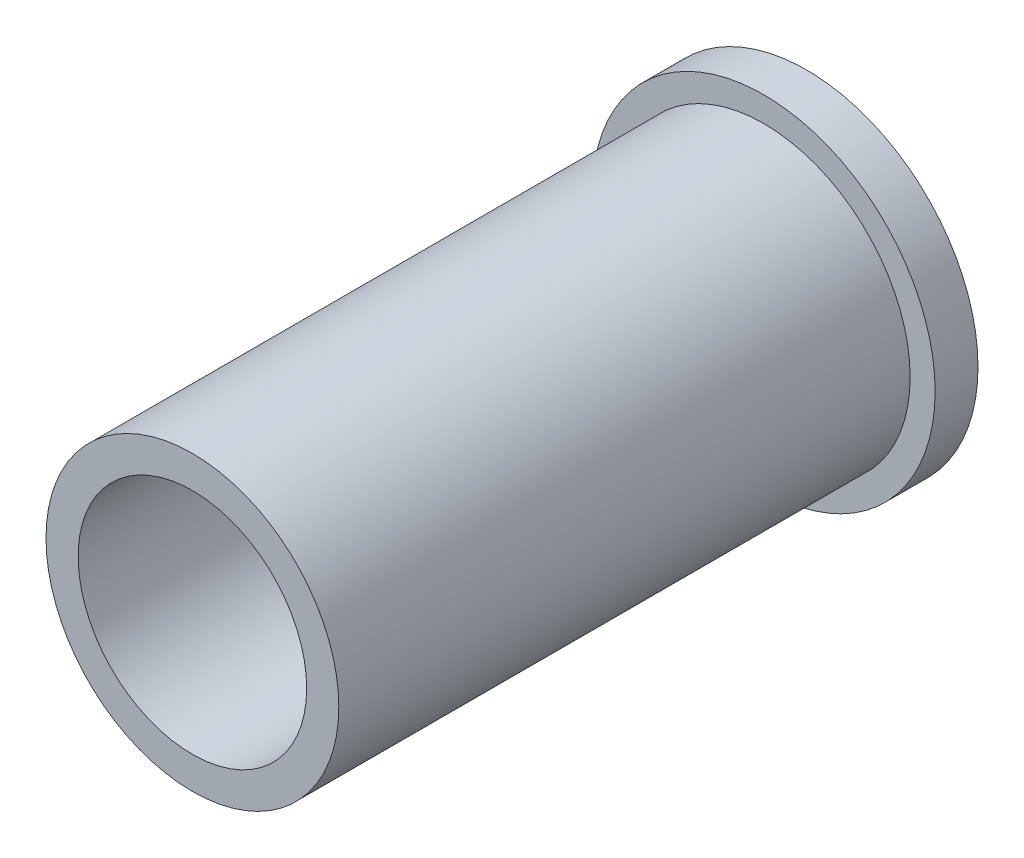
ISO-10303-21;
HEADER;
FILE_DESCRIPTION(('STEP AP214'),'2;1');
FILE_NAME('part.step','',(''),(''),'','','');
FILE_SCHEMA(('AUTOMOTIVE_DESIGN { 1 0 10303 214 1 1 1 1 }'));
ENDSEC;
DATA;
#1=APPLICATION_CONTEXT('core data for automotive mechanical design processes');
#2=APPLICATION_PROTOCOL_DEFINITION('international standard','automotive_design',2000,#1);
#3=PRODUCT_CONTEXT('',#1,'mechanical');
#4=PRODUCT('Part','Part','',(#3));
#5=PRODUCT_RELATED_PRODUCT_CATEGORY('part','',(#4));
#6=PRODUCT_DEFINITION_FORMATION('','',#4);
#7=PRODUCT_DEFINITION_CONTEXT('part definition',#1,'design');
#8=PRODUCT_DEFINITION('design','',#6,#7);
#9=PRODUCT_DEFINITION_SHAPE('','',#8);
#10=(LENGTH_UNIT() NAMED_UNIT(*) SI_UNIT(.MILLI.,.METRE.));
#11=(NAMED_UNIT(*) PLANE_ANGLE_UNIT() SI_UNIT($,.RADIAN.));
#12=(NAMED_UNIT(*) SI_UNIT($,.STERADIAN.) SOLID_ANGLE_UNIT());
#13=UNCERTAINTY_MEASURE_WITH_UNIT(LENGTH_MEASURE(1.E-05),#10,'distance_accuracy_value','');
#14=(GEOMETRIC_REPRESENTATION_CONTEXT(3) GLOBAL_UNCERTAINTY_ASSIGNED_CONTEXT((#13)) GLOBAL_UNIT_ASSIGNED_CONTEXT((#10,
#11,#12)) REPRESENTATION_CONTEXT('',''));
#15=CARTESIAN_POINT('',(0.,0.,0.));
#16=DIRECTION('',(0.,0.,1.));
#17=DIRECTION('',(1.,0.,0.));
#18=AXIS2_PLACEMENT_3D('',#15,#16,#17);
#19=CARTESIAN_POINT('',(0.,0.,3.));
#20=DIRECTION('',(0.,0.,1.));
#21=DIRECTION('',(1.,0.,0.));
#22=AXIS2_PLACEMENT_3D('',#19,#20,#21);
#23=PLANE('',#22);
#24=CARTESIAN_POINT('',(0.,0.,3.));
#25=DIRECTION('',(0.,0.,1.));
#26=DIRECTION('',(1.,0.,0.));
#27=AXIS2_PLACEMENT_3D('',#24,#25,#26);
#28=CIRCLE('',#27,12.);
#29=CARTESIAN_POINT('',(12.,0.,3.));
#30=VERTEX_POINT('',#29);
#31=EDGE_CURVE('E10',#30,#30,#28,.T.);
#32=ORIENTED_EDGE('',*,*,#31,.T.);
#33=EDGE_LOOP('',(#32));
#34=FACE_BOUND('',#33,.T.);
#35=CARTESIAN_POINT('',(0.,0.,3.));
#36=DIRECTION('',(0.,0.,1.));
#37=DIRECTION('',(1.,0.,0.));
#38=AXIS2_PLACEMENT_3D('',#35,#36,#37);
#39=CIRCLE('',#38,10.25);
#40=CARTESIAN_POINT('',(10.25,0.,3.));
#41=VERTEX_POINT('',#40);
#42=EDGE_CURVE('E48',#41,#41,#39,.T.);
#43=ORIENTED_EDGE('',*,*,#42,.F.);
#44=EDGE_LOOP('',(#43));
#45=FACE_BOUND('',#44,.T.);
#46=ADVANCED_FACE('F32',(#34,#45),#23,.T.);
#47=CARTESIAN_POINT('',(0.,0.,0.));
#48=DIRECTION('',(0.,0.,1.));
#49=DIRECTION('',(1.,0.,0.));
#50=AXIS2_PLACEMENT_3D('',#47,#48,#49);
#51=PLANE('',#50);
#52=CARTESIAN_POINT('',(0.,0.,0.));
#53=DIRECTION('',(0.,0.,1.));
#54=DIRECTION('',(1.,0.,0.));
#55=AXIS2_PLACEMENT_3D('',#52,#53,#54);
#56=CIRCLE('',#55,12.);
#57=CARTESIAN_POINT('',(12.,0.,0.));
#58=VERTEX_POINT('',#57);
#59=EDGE_CURVE('E36',#58,#58,#56,.T.);
#60=ORIENTED_EDGE('',*,*,#59,.F.);
#61=EDGE_LOOP('',(#60));
#62=FACE_BOUND('',#61,.T.);
#63=CARTESIAN_POINT('',(0.,0.,0.));
#64=DIRECTION('',(0.,0.,1.));
#65=DIRECTION('',(1.,0.,0.));
#66=AXIS2_PLACEMENT_3D('',#63,#64,#65);
#67=CIRCLE('',#66,8.);
#68=CARTESIAN_POINT('',(8.,0.,0.));
#69=VERTEX_POINT('',#68);
#70=EDGE_CURVE('E43',#69,#69,#67,.T.);
#71=ORIENTED_EDGE('',*,*,#70,.T.);
#72=EDGE_LOOP('',(#71));
#73=FACE_BOUND('',#72,.T.);
#74=ADVANCED_FACE('F73',(#62,#73),#51,.F.);
#75=CARTESIAN_POINT('',(0.,0.,3.));
#76=DIRECTION('',(0.,0.,-1.));
#77=DIRECTION('',(-1.,0.,0.));
#78=AXIS2_PLACEMENT_3D('',#75,#76,#77);
#79=CYLINDRICAL_SURFACE('',#78,12.);
#80=ORIENTED_EDGE('',*,*,#31,.F.);
#81=EDGE_LOOP('',(#80));
#82=FACE_BOUND('',#81,.T.);
#83=ORIENTED_EDGE('',*,*,#59,.T.);
#84=EDGE_LOOP('',(#83));
#85=FACE_BOUND('',#84,.T.);
#86=ADVANCED_FACE('F34',(#82,#85),#79,.T.);
#87=CARTESIAN_POINT('',(0.,0.,3.));
#88=DIRECTION('',(0.,0.,-1.));
#89=DIRECTION('',(-1.,0.,0.));
#90=AXIS2_PLACEMENT_3D('',#87,#88,#89);
#91=CYLINDRICAL_SURFACE('',#90,8.);
#92=ORIENTED_EDGE('',*,*,#70,.F.);
#93=EDGE_LOOP('',(#92));
#94=FACE_BOUND('',#93,.T.);
#95=CARTESIAN_POINT('',(0.,0.,43.));
#96=DIRECTION('',(0.,0.,1.));
#97=DIRECTION('',(1.,0.,0.));
#98=AXIS2_PLACEMENT_3D('',#95,#96,#97);
#99=CIRCLE('',#98,8.);
#100=CARTESIAN_POINT('',(8.,0.,43.));
#101=VERTEX_POINT('',#100);
#102=EDGE_CURVE('E51',#101,#101,#99,.T.);
#103=ORIENTED_EDGE('',*,*,#102,.T.);
#104=EDGE_LOOP('',(#103));
#105=FACE_BOUND('',#104,.T.);
#106=ADVANCED_FACE('F57',(#94,#105),#91,.F.);
#107=CARTESIAN_POINT('',(0.,0.,43.));
#108=DIRECTION('',(0.,0.,1.));
#109=DIRECTION('',(1.,0.,0.));
#110=AXIS2_PLACEMENT_3D('',#107,#108,#109);
#111=PLANE('',#110);
#112=CARTESIAN_POINT('',(0.,0.,43.));
#113=DIRECTION('',(0.,0.,1.));
#114=DIRECTION('',(1.,0.,0.));
#115=AXIS2_PLACEMENT_3D('',#112,#113,#114);
#116=CIRCLE('',#115,10.25);
#117=CARTESIAN_POINT('',(10.25,0.,43.));
#118=VERTEX_POINT('',#117);
#119=EDGE_CURVE('E47',#118,#118,#116,.T.);
#120=ORIENTED_EDGE('',*,*,#119,.T.);
#121=EDGE_LOOP('',(#120));
#122=FACE_BOUND('',#121,.T.);
#123=ORIENTED_EDGE('',*,*,#102,.F.);
#124=EDGE_LOOP('',(#123));
#125=FACE_BOUND('',#124,.T.);
#126=ADVANCED_FACE('F59',(#122,#125),#111,.T.);
#127=CARTESIAN_POINT('',(0.,0.,43.));
#128=DIRECTION('',(0.,0.,-1.));
#129=DIRECTION('',(-1.,0.,0.));
#130=AXIS2_PLACEMENT_3D('',#127,#128,#129);
#131=CYLINDRICAL_SURFACE('',#130,10.25);
#132=ORIENTED_EDGE('',*,*,#119,.F.);
#133=EDGE_LOOP('',(#132));
#134=FACE_BOUND('',#133,.T.);
#135=ORIENTED_EDGE('',*,*,#42,.T.);
#136=EDGE_LOOP('',(#135));
#137=FACE_BOUND('',#136,.T.);
#138=ADVANCED_FACE('F61',(#134,#137),#131,.T.);
#139=CLOSED_SHELL('',(#46,#74,#86,#106,#126,#138));
#140=MANIFOLD_SOLID_BREP('B2',#139);
#141=ADVANCED_BREP_SHAPE_REPRESENTATION('',(#18,#140),#14);
#142=SHAPE_DEFINITION_REPRESENTATION(#9,#141);
ENDSEC;
END-ISO-10303-21;
